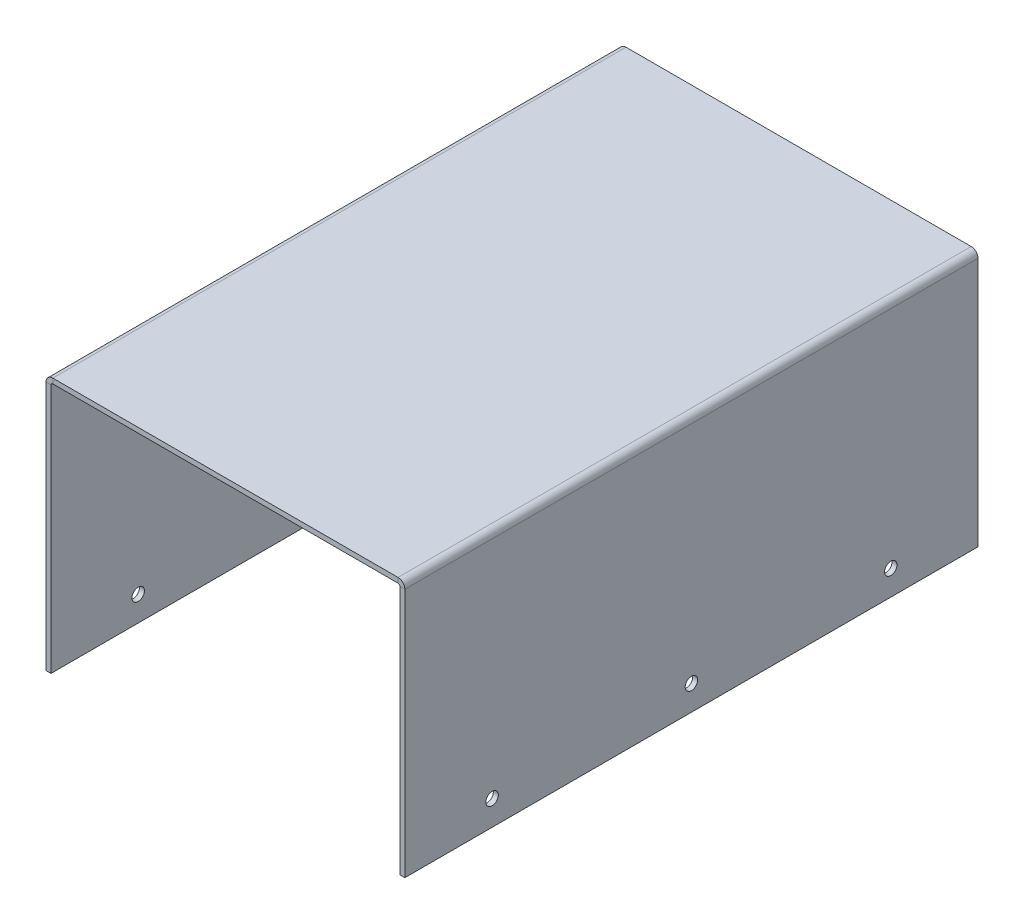
ISO-10303-21;
HEADER;
FILE_DESCRIPTION(('STEP AP214'),'2;1');
FILE_NAME('part.step','',(''),(''),'','','');
FILE_SCHEMA(('AUTOMOTIVE_DESIGN { 1 0 10303 214 1 1 1 1 }'));
ENDSEC;
DATA;
#1=APPLICATION_CONTEXT('core data for automotive mechanical design processes');
#2=APPLICATION_PROTOCOL_DEFINITION('international standard','automotive_design',2000,#1);
#3=PRODUCT_CONTEXT('',#1,'mechanical');
#4=PRODUCT('Part','Part','',(#3));
#5=PRODUCT_RELATED_PRODUCT_CATEGORY('part','',(#4));
#6=PRODUCT_DEFINITION_FORMATION('','',#4);
#7=PRODUCT_DEFINITION_CONTEXT('part definition',#1,'design');
#8=PRODUCT_DEFINITION('design','',#6,#7);
#9=PRODUCT_DEFINITION_SHAPE('','',#8);
#10=(LENGTH_UNIT() NAMED_UNIT(*) SI_UNIT(.MILLI.,.METRE.));
#11=(NAMED_UNIT(*) PLANE_ANGLE_UNIT() SI_UNIT($,.RADIAN.));
#12=(NAMED_UNIT(*) SI_UNIT($,.STERADIAN.) SOLID_ANGLE_UNIT());
#13=UNCERTAINTY_MEASURE_WITH_UNIT(LENGTH_MEASURE(1.E-05),#10,'distance_accuracy_value','');
#14=(GEOMETRIC_REPRESENTATION_CONTEXT(3) GLOBAL_UNCERTAINTY_ASSIGNED_CONTEXT((#13)) GLOBAL_UNIT_ASSIGNED_CONTEXT((#10,
#11,#12)) REPRESENTATION_CONTEXT('',''));
#15=CARTESIAN_POINT('',(0.,0.,0.));
#16=DIRECTION('',(0.,0.,1.));
#17=DIRECTION('',(1.,0.,0.));
#18=AXIS2_PLACEMENT_3D('',#15,#16,#17);
#19=CARTESIAN_POINT('',(-70.,2.,-115.));
#20=DIRECTION('',(0.,0.,1.));
#21=DIRECTION('',(1.,0.,0.));
#22=AXIS2_PLACEMENT_3D('',#19,#20,#21);
#23=PLANE('',#22);
#24=DIRECTION('',(0.,1.,0.));
#25=VECTOR('',#24,1.);
#26=CARTESIAN_POINT('',(-69.2634,0.,-115.));
#27=LINE('',#26,#25);
#28=CARTESIAN_POINT('',(-69.2634,0.,-115.));
#29=VERTEX_POINT('',#28);
#30=CARTESIAN_POINT('',(-69.2634,1.99999999999998,-115.));
#31=VERTEX_POINT('',#30);
#32=EDGE_CURVE('E193',#29,#31,#27,.T.);
#33=ORIENTED_EDGE('',*,*,#32,.T.);
#34=DIRECTION('',(-1.,0.,0.));
#35=VECTOR('',#34,1.);
#36=CARTESIAN_POINT('',(-70.,2.,-115.));
#37=LINE('',#36,#35);
#38=CARTESIAN_POINT('',(69.2634,2.,-115.));
#39=VERTEX_POINT('',#38);
#40=EDGE_CURVE('E58',#39,#31,#37,.T.);
#41=ORIENTED_EDGE('',*,*,#40,.F.);
#42=DIRECTION('',(0.,1.,0.));
#43=VECTOR('',#42,1.);
#44=CARTESIAN_POINT('',(69.2634,0.,-115.));
#45=LINE('',#44,#43);
#46=CARTESIAN_POINT('',(69.2634,0.,-115.));
#47=VERTEX_POINT('',#46);
#48=EDGE_CURVE('E270',#47,#39,#45,.T.);
#49=ORIENTED_EDGE('',*,*,#48,.F.);
#50=DIRECTION('',(-1.,0.,0.));
#51=VECTOR('',#50,1.);
#52=CARTESIAN_POINT('',(-70.,0.,-115.));
#53=LINE('',#52,#51);
#54=EDGE_CURVE('E273',#47,#29,#53,.T.);
#55=ORIENTED_EDGE('',*,*,#54,.T.);
#56=EDGE_LOOP('',(#33,#41,#49,#55));
#57=FACE_BOUND('',#56,.T.);
#58=ADVANCED_FACE('F50',(#57),#23,.F.);
#59=CARTESIAN_POINT('',(-70.,2.,115.));
#60=DIRECTION('',(0.,0.,-1.));
#61=DIRECTION('',(-1.,0.,0.));
#62=AXIS2_PLACEMENT_3D('',#59,#60,#61);
#63=PLANE('',#62);
#64=DIRECTION('',(0.,1.,0.));
#65=VECTOR('',#64,1.);
#66=CARTESIAN_POINT('',(-69.2634,0.,115.));
#67=LINE('',#66,#65);
#68=CARTESIAN_POINT('',(-69.2634,0.,115.));
#69=VERTEX_POINT('',#68);
#70=CARTESIAN_POINT('',(-69.2634,2.,115.));
#71=VERTEX_POINT('',#70);
#72=EDGE_CURVE('E199',#69,#71,#67,.T.);
#73=ORIENTED_EDGE('',*,*,#72,.F.);
#74=DIRECTION('',(1.,0.,0.));
#75=VECTOR('',#74,1.);
#76=CARTESIAN_POINT('',(-70.,0.,115.));
#77=LINE('',#76,#75);
#78=CARTESIAN_POINT('',(69.2634,0.,115.));
#79=VERTEX_POINT('',#78);
#80=EDGE_CURVE('E53',#69,#79,#77,.T.);
#81=ORIENTED_EDGE('',*,*,#80,.T.);
#82=DIRECTION('',(0.,1.,0.));
#83=VECTOR('',#82,1.);
#84=CARTESIAN_POINT('',(69.2634,0.,115.));
#85=LINE('',#84,#83);
#86=CARTESIAN_POINT('',(69.2634,2.00000000000001,115.));
#87=VERTEX_POINT('',#86);
#88=EDGE_CURVE('E259',#79,#87,#85,.T.);
#89=ORIENTED_EDGE('',*,*,#88,.T.);
#90=DIRECTION('',(1.,0.,0.));
#91=VECTOR('',#90,1.);
#92=CARTESIAN_POINT('',(-70.,2.,115.));
#93=LINE('',#92,#91);
#94=EDGE_CURVE('E13',#71,#87,#93,.T.);
#95=ORIENTED_EDGE('',*,*,#94,.F.);
#96=EDGE_LOOP('',(#73,#81,#89,#95));
#97=FACE_BOUND('',#96,.T.);
#98=ADVANCED_FACE('F337',(#97),#63,.F.);
#99=CARTESIAN_POINT('',(0.,2.,0.));
#100=DIRECTION('',(0.,-1.,0.));
#101=DIRECTION('',(0.,0.,-1.));
#102=AXIS2_PLACEMENT_3D('',#99,#100,#101);
#103=PLANE('',#102);
#104=DIRECTION('',(0.,0.,-1.));
#105=VECTOR('',#104,1.);
#106=CARTESIAN_POINT('',(-69.2634,1.99999999999998,-115.));
#107=LINE('',#106,#105);
#108=EDGE_CURVE('E147',#31,#71,#107,.F.);
#109=ORIENTED_EDGE('',*,*,#108,.T.);
#110=ORIENTED_EDGE('',*,*,#94,.T.);
#111=DIRECTION('',(0.,0.,1.));
#112=VECTOR('',#111,1.);
#113=CARTESIAN_POINT('',(69.2634,2.00000000000001,115.));
#114=LINE('',#113,#112);
#115=EDGE_CURVE('E253',#87,#39,#114,.F.);
#116=ORIENTED_EDGE('',*,*,#115,.T.);
#117=ORIENTED_EDGE('',*,*,#40,.T.);
#118=EDGE_LOOP('',(#109,#110,#116,#117));
#119=FACE_BOUND('',#118,.T.);
#120=ADVANCED_FACE('F388',(#119),#103,.F.);
#121=CARTESIAN_POINT('',(0.,0.,0.));
#122=DIRECTION('',(0.,-1.,0.));
#123=DIRECTION('',(0.,0.,-1.));
#124=AXIS2_PLACEMENT_3D('',#121,#122,#123);
#125=PLANE('',#124);
#126=ORIENTED_EDGE('',*,*,#80,.F.);
#127=DIRECTION('',(0.,0.,-1.));
#128=VECTOR('',#127,1.);
#129=CARTESIAN_POINT('',(-69.2634,0.,-115.));
#130=LINE('',#129,#128);
#131=EDGE_CURVE('E66',#29,#69,#130,.F.);
#132=ORIENTED_EDGE('',*,*,#131,.F.);
#133=ORIENTED_EDGE('',*,*,#54,.F.);
#134=DIRECTION('',(0.,0.,1.));
#135=VECTOR('',#134,1.);
#136=CARTESIAN_POINT('',(69.2634,0.,115.));
#137=LINE('',#136,#135);
#138=EDGE_CURVE('E265',#79,#47,#137,.F.);
#139=ORIENTED_EDGE('',*,*,#138,.F.);
#140=EDGE_LOOP('',(#126,#132,#133,#139));
#141=FACE_BOUND('',#140,.T.);
#142=ADVANCED_FACE('F338',(#141),#125,.T.);
#143=CARTESIAN_POINT('',(72.,2.57057950897709E-13,0.));
#144=DIRECTION('',(-1.,0.,0.));
#145=DIRECTION('',(0.,-1.,0.));
#146=AXIS2_PLACEMENT_3D('',#143,#144,#145);
#147=PLANE('',#146);
#148=CARTESIAN_POINT('',(72.0000000000003,-91.,-80.));
#149=DIRECTION('',(1.,0.,0.));
#150=DIRECTION('',(0.,0.,-1.));
#151=AXIS2_PLACEMENT_3D('',#148,#149,#150);
#152=CIRCLE('',#151,2.49999999999999);
#153=CARTESIAN_POINT('',(72.0000000000003,-91.,-82.5));
#154=VERTEX_POINT('',#153);
#155=EDGE_CURVE('E210',#154,#154,#152,.T.);
#156=ORIENTED_EDGE('',*,*,#155,.F.);
#157=EDGE_LOOP('',(#156));
#158=FACE_BOUND('',#157,.T.);
#159=CARTESIAN_POINT('',(72.0000000000003,-91.0000000000002,80.));
#160=DIRECTION('',(1.,0.,0.));
#161=DIRECTION('',(0.,0.,-1.));
#162=AXIS2_PLACEMENT_3D('',#159,#160,#161);
#163=CIRCLE('',#162,2.49999999999999);
#164=CARTESIAN_POINT('',(72.0000000000003,-91.0000000000002,77.5));
#165=VERTEX_POINT('',#164);
#166=EDGE_CURVE('E216',#165,#165,#163,.T.);
#167=ORIENTED_EDGE('',*,*,#166,.F.);
#168=EDGE_LOOP('',(#167));
#169=FACE_BOUND('',#168,.T.);
#170=DIRECTION('',(0.,0.,-1.));
#171=VECTOR('',#170,1.);
#172=CARTESIAN_POINT('',(72.,-0.73659999999999,0.));
#173=LINE('',#172,#171);
#174=CARTESIAN_POINT('',(72.,-0.736599999999983,115.));
#175=VERTEX_POINT('',#174);
#176=CARTESIAN_POINT('',(72.,-0.736599999999998,-115.));
#177=VERTEX_POINT('',#176);
#178=EDGE_CURVE('E228',#175,#177,#173,.T.);
#179=ORIENTED_EDGE('',*,*,#178,.F.);
#180=DIRECTION('',(0.,-1.,0.));
#181=VECTOR('',#180,1.);
#182=CARTESIAN_POINT('',(72.0000000000004,-101.,115.));
#183=LINE('',#182,#181);
#184=CARTESIAN_POINT('',(72.0000000000004,-101.,115.));
#185=VERTEX_POINT('',#184);
#186=EDGE_CURVE('E233',#175,#185,#183,.T.);
#187=ORIENTED_EDGE('',*,*,#186,.T.);
#188=DIRECTION('',(0.,0.,-1.));
#189=VECTOR('',#188,1.);
#190=CARTESIAN_POINT('',(72.0000000000004,-101.,-115.));
#191=LINE('',#190,#189);
#192=CARTESIAN_POINT('',(72.0000000000004,-101.,-115.));
#193=VERTEX_POINT('',#192);
#194=EDGE_CURVE('E235',#185,#193,#191,.T.);
#195=ORIENTED_EDGE('',*,*,#194,.T.);
#196=DIRECTION('',(0.,1.,0.));
#197=VECTOR('',#196,1.);
#198=CARTESIAN_POINT('',(72.,0.,-115.));
#199=LINE('',#198,#197);
#200=EDGE_CURVE('E238',#193,#177,#199,.T.);
#201=ORIENTED_EDGE('',*,*,#200,.T.);
#202=EDGE_LOOP('',(#179,#187,#195,#201));
#203=FACE_BOUND('',#202,.T.);
#204=CARTESIAN_POINT('',(72.0000000000003,-91.,0.));
#205=DIRECTION('',(1.,0.,0.));
#206=DIRECTION('',(0.,0.,-1.));
#207=AXIS2_PLACEMENT_3D('',#204,#205,#206);
#208=CIRCLE('',#207,2.49999999999999);
#209=CARTESIAN_POINT('',(72.0000000000003,-91.,-2.49999999999995));
#210=VERTEX_POINT('',#209);
#211=EDGE_CURVE('E202',#210,#210,#208,.T.);
#212=ORIENTED_EDGE('',*,*,#211,.F.);
#213=EDGE_LOOP('',(#212));
#214=FACE_BOUND('',#213,.T.);
#215=ADVANCED_FACE('F367',(#158,#169,#203,#214),#147,.F.);
#216=CARTESIAN_POINT('',(69.2634,-0.736600000000008,-115.));
#217=DIRECTION('',(0.,0.,-1.));
#218=DIRECTION('',(0.,1.,0.));
#219=AXIS2_PLACEMENT_3D('',#216,#217,#218);
#220=PLANE('',#219);
#221=DIRECTION('',(1.,0.,0.));
#222=VECTOR('',#221,1.);
#223=CARTESIAN_POINT('',(70.,-0.736600000000004,-115.));
#224=LINE('',#223,#222);
#225=CARTESIAN_POINT('',(70.,-0.736600000000005,-115.));
#226=VERTEX_POINT('',#225);
#227=EDGE_CURVE('E222',#226,#177,#224,.T.);
#228=ORIENTED_EDGE('',*,*,#227,.F.);
#229=CARTESIAN_POINT('',(69.2634,-0.736600000000008,-115.));
#230=DIRECTION('',(0.,0.,1.));
#231=DIRECTION('',(0.,-1.,0.));
#232=AXIS2_PLACEMENT_3D('',#229,#230,#231);
#233=CIRCLE('',#232,0.736600000000004);
#234=EDGE_CURVE('E262',#47,#226,#233,.F.);
#235=ORIENTED_EDGE('',*,*,#234,.F.);
#236=ORIENTED_EDGE('',*,*,#48,.T.);
#237=CARTESIAN_POINT('',(69.2634,-0.736600000000008,-115.));
#238=DIRECTION('',(0.,0.,1.));
#239=DIRECTION('',(0.,-1.,0.));
#240=AXIS2_PLACEMENT_3D('',#237,#238,#239);
#241=CIRCLE('',#240,2.7366);
#242=EDGE_CURVE('E255',#39,#177,#241,.F.);
#243=ORIENTED_EDGE('',*,*,#242,.T.);
#244=EDGE_LOOP('',(#228,#235,#236,#243));
#245=FACE_BOUND('',#244,.T.);
#246=ADVANCED_FACE('F373',(#245),#220,.T.);
#247=CARTESIAN_POINT('',(69.2634,-0.736599999999991,115.));
#248=DIRECTION('',(0.,0.,-1.));
#249=DIRECTION('',(0.,1.,0.));
#250=AXIS2_PLACEMENT_3D('',#247,#248,#249);
#251=PLANE('',#250);
#252=CARTESIAN_POINT('',(69.2634,-0.736599999999991,115.));
#253=DIRECTION('',(0.,0.,1.));
#254=DIRECTION('',(0.,-1.,0.));
#255=AXIS2_PLACEMENT_3D('',#252,#253,#254);
#256=CIRCLE('',#255,0.736600000000004);
#257=CARTESIAN_POINT('',(70.,-0.736599999999988,115.));
#258=VERTEX_POINT('',#257);
#259=EDGE_CURVE('E252',#258,#79,#256,.T.);
#260=ORIENTED_EDGE('',*,*,#259,.F.);
#261=DIRECTION('',(1.,0.,0.));
#262=VECTOR('',#261,1.);
#263=CARTESIAN_POINT('',(70.,-0.73659999999999,115.));
#264=LINE('',#263,#262);
#265=EDGE_CURVE('E225',#258,#175,#264,.T.);
#266=ORIENTED_EDGE('',*,*,#265,.T.);
#267=CARTESIAN_POINT('',(69.2634,-0.736599999999991,115.));
#268=DIRECTION('',(0.,0.,1.));
#269=DIRECTION('',(0.,-1.,0.));
#270=AXIS2_PLACEMENT_3D('',#267,#268,#269);
#271=CIRCLE('',#270,2.7366);
#272=EDGE_CURVE('E256',#175,#87,#271,.T.);
#273=ORIENTED_EDGE('',*,*,#272,.T.);
#274=ORIENTED_EDGE('',*,*,#88,.F.);
#275=EDGE_LOOP('',(#260,#266,#273,#274));
#276=FACE_BOUND('',#275,.T.);
#277=ADVANCED_FACE('F344',(#276),#251,.F.);
#278=CARTESIAN_POINT('',(69.2634,-0.736599999999991,115.));
#279=DIRECTION('',(0.,0.,1.));
#280=DIRECTION('',(1.,0.,0.));
#281=AXIS2_PLACEMENT_3D('',#278,#279,#280);
#282=CYLINDRICAL_SURFACE('',#281,2.7366);
#283=ORIENTED_EDGE('',*,*,#115,.F.);
#284=ORIENTED_EDGE('',*,*,#272,.F.);
#285=ORIENTED_EDGE('',*,*,#178,.T.);
#286=ORIENTED_EDGE('',*,*,#242,.F.);
#287=EDGE_LOOP('',(#283,#284,#285,#286));
#288=FACE_BOUND('',#287,.T.);
#289=ADVANCED_FACE('F371',(#288),#282,.T.);
#290=CARTESIAN_POINT('',(69.2634,-0.736599999999991,115.));
#291=DIRECTION('',(0.,0.,1.));
#292=DIRECTION('',(1.,0.,0.));
#293=AXIS2_PLACEMENT_3D('',#290,#291,#292);
#294=CYLINDRICAL_SURFACE('',#293,0.736600000000004);
#295=ORIENTED_EDGE('',*,*,#138,.T.);
#296=ORIENTED_EDGE('',*,*,#234,.T.);
#297=DIRECTION('',(0.,0.,1.));
#298=VECTOR('',#297,1.);
#299=CARTESIAN_POINT('',(70.,-0.736600000000004,-115.));
#300=LINE('',#299,#298);
#301=EDGE_CURVE('E223',#226,#258,#300,.T.);
#302=ORIENTED_EDGE('',*,*,#301,.T.);
#303=ORIENTED_EDGE('',*,*,#259,.T.);
#304=EDGE_LOOP('',(#295,#296,#302,#303));
#305=FACE_BOUND('',#304,.T.);
#306=ADVANCED_FACE('F347',(#305),#294,.F.);
#307=CARTESIAN_POINT('',(72.0000000000004,-101.,115.));
#308=DIRECTION('',(0.,0.,-1.));
#309=DIRECTION('',(0.,1.,0.));
#310=AXIS2_PLACEMENT_3D('',#307,#308,#309);
#311=PLANE('',#310);
#312=ORIENTED_EDGE('',*,*,#265,.F.);
#313=DIRECTION('',(0.,-1.,0.));
#314=VECTOR('',#313,1.);
#315=CARTESIAN_POINT('',(70.0000000000004,-101.,115.));
#316=LINE('',#315,#314);
#317=CARTESIAN_POINT('',(70.0000000000004,-101.,115.));
#318=VERTEX_POINT('',#317);
#319=EDGE_CURVE('E232',#258,#318,#316,.T.);
#320=ORIENTED_EDGE('',*,*,#319,.T.);
#321=DIRECTION('',(-1.,0.,0.));
#322=VECTOR('',#321,1.);
#323=CARTESIAN_POINT('',(72.0000000000004,-101.,115.));
#324=LINE('',#323,#322);
#325=EDGE_CURVE('E249',#185,#318,#324,.T.);
#326=ORIENTED_EDGE('',*,*,#325,.F.);
#327=ORIENTED_EDGE('',*,*,#186,.F.);
#328=EDGE_LOOP('',(#312,#320,#326,#327));
#329=FACE_BOUND('',#328,.T.);
#330=ADVANCED_FACE('F364',(#329),#311,.F.);
#331=CARTESIAN_POINT('',(72.,0.,-115.));
#332=DIRECTION('',(0.,0.,1.));
#333=DIRECTION('',(0.,-1.,0.));
#334=AXIS2_PLACEMENT_3D('',#331,#332,#333);
#335=PLANE('',#334);
#336=ORIENTED_EDGE('',*,*,#227,.T.);
#337=ORIENTED_EDGE('',*,*,#200,.F.);
#338=DIRECTION('',(-1.,0.,0.));
#339=VECTOR('',#338,1.);
#340=CARTESIAN_POINT('',(72.0000000000004,-101.,-115.));
#341=LINE('',#340,#339);
#342=CARTESIAN_POINT('',(70.0000000000004,-101.,-115.));
#343=VERTEX_POINT('',#342);
#344=EDGE_CURVE('E241',#193,#343,#341,.T.);
#345=ORIENTED_EDGE('',*,*,#344,.T.);
#346=DIRECTION('',(0.,1.,0.));
#347=VECTOR('',#346,1.);
#348=CARTESIAN_POINT('',(70.,0.,-115.));
#349=LINE('',#348,#347);
#350=EDGE_CURVE('E236',#343,#226,#349,.T.);
#351=ORIENTED_EDGE('',*,*,#350,.T.);
#352=EDGE_LOOP('',(#336,#337,#345,#351));
#353=FACE_BOUND('',#352,.T.);
#354=ADVANCED_FACE('F355',(#353),#335,.F.);
#355=CARTESIAN_POINT('',(70.,2.50074988220023E-13,0.));
#356=DIRECTION('',(-1.,0.,0.));
#357=DIRECTION('',(0.,-1.,0.));
#358=AXIS2_PLACEMENT_3D('',#355,#356,#357);
#359=PLANE('',#358);
#360=CARTESIAN_POINT('',(70.0000000000003,-91.,0.));
#361=DIRECTION('',(-1.,0.,0.));
#362=DIRECTION('',(0.,-1.,0.));
#363=AXIS2_PLACEMENT_3D('',#360,#361,#362);
#364=CIRCLE('',#363,2.5);
#365=CARTESIAN_POINT('',(70.0000000000003,-93.5,0.));
#366=VERTEX_POINT('',#365);
#367=EDGE_CURVE('E207',#366,#366,#364,.T.);
#368=ORIENTED_EDGE('',*,*,#367,.F.);
#369=EDGE_LOOP('',(#368));
#370=FACE_BOUND('',#369,.T.);
#371=CARTESIAN_POINT('',(70.0000000000003,-91.,-80.));
#372=DIRECTION('',(-1.,0.,0.));
#373=DIRECTION('',(0.,-1.,0.));
#374=AXIS2_PLACEMENT_3D('',#371,#372,#373);
#375=CIRCLE('',#374,2.5);
#376=CARTESIAN_POINT('',(70.0000000000004,-93.5,-80.));
#377=VERTEX_POINT('',#376);
#378=EDGE_CURVE('E213',#377,#377,#375,.T.);
#379=ORIENTED_EDGE('',*,*,#378,.F.);
#380=EDGE_LOOP('',(#379));
#381=FACE_BOUND('',#380,.T.);
#382=CARTESIAN_POINT('',(70.0000000000003,-91.0000000000002,80.));
#383=DIRECTION('',(-1.,0.,0.));
#384=DIRECTION('',(0.,-1.,0.));
#385=AXIS2_PLACEMENT_3D('',#382,#383,#384);
#386=CIRCLE('',#385,2.5);
#387=CARTESIAN_POINT('',(70.0000000000003,-93.5000000000002,80.));
#388=VERTEX_POINT('',#387);
#389=EDGE_CURVE('E219',#388,#388,#386,.T.);
#390=ORIENTED_EDGE('',*,*,#389,.F.);
#391=EDGE_LOOP('',(#390));
#392=FACE_BOUND('',#391,.T.);
#393=ORIENTED_EDGE('',*,*,#319,.F.);
#394=ORIENTED_EDGE('',*,*,#301,.F.);
#395=ORIENTED_EDGE('',*,*,#350,.F.);
#396=DIRECTION('',(0.,0.,-1.));
#397=VECTOR('',#396,1.);
#398=CARTESIAN_POINT('',(70.0000000000004,-101.,-115.));
#399=LINE('',#398,#397);
#400=EDGE_CURVE('E243',#318,#343,#399,.T.);
#401=ORIENTED_EDGE('',*,*,#400,.F.);
#402=EDGE_LOOP('',(#393,#394,#395,#401));
#403=FACE_BOUND('',#402,.T.);
#404=ADVANCED_FACE('F352',(#370,#381,#392,#403),#359,.T.);
#405=CARTESIAN_POINT('',(72.0000000000004,-101.,-115.));
#406=DIRECTION('',(0.,1.,0.));
#407=DIRECTION('',(-1.,0.,0.));
#408=AXIS2_PLACEMENT_3D('',#405,#406,#407);
#409=PLANE('',#408);
#410=ORIENTED_EDGE('',*,*,#400,.T.);
#411=ORIENTED_EDGE('',*,*,#344,.F.);
#412=ORIENTED_EDGE('',*,*,#194,.F.);
#413=ORIENTED_EDGE('',*,*,#325,.T.);
#414=EDGE_LOOP('',(#410,#411,#412,#413));
#415=FACE_BOUND('',#414,.T.);
#416=ADVANCED_FACE('F360',(#415),#409,.F.);
#417=CARTESIAN_POINT('',(72.0000000000003,-91.0000000000002,80.));
#418=DIRECTION('',(1.,0.,0.));
#419=DIRECTION('',(0.,0.,-1.));
#420=AXIS2_PLACEMENT_3D('',#417,#418,#419);
#421=CYLINDRICAL_SURFACE('',#420,2.5);
#422=ORIENTED_EDGE('',*,*,#166,.T.);
#423=EDGE_LOOP('',(#422));
#424=FACE_BOUND('',#423,.T.);
#425=ORIENTED_EDGE('',*,*,#389,.T.);
#426=EDGE_LOOP('',(#425));
#427=FACE_BOUND('',#426,.T.);
#428=ADVANCED_FACE('F429',(#424,#427),#421,.F.);
#429=CARTESIAN_POINT('',(72.0000000000003,-91.,-80.));
#430=DIRECTION('',(1.,0.,0.));
#431=DIRECTION('',(0.,0.,-1.));
#432=AXIS2_PLACEMENT_3D('',#429,#430,#431);
#433=CYLINDRICAL_SURFACE('',#432,2.5);
#434=ORIENTED_EDGE('',*,*,#155,.T.);
#435=EDGE_LOOP('',(#434));
#436=FACE_BOUND('',#435,.T.);
#437=ORIENTED_EDGE('',*,*,#378,.T.);
#438=EDGE_LOOP('',(#437));
#439=FACE_BOUND('',#438,.T.);
#440=ADVANCED_FACE('F434',(#436,#439),#433,.F.);
#441=CARTESIAN_POINT('',(72.0000000000003,-91.,0.));
#442=DIRECTION('',(1.,0.,0.));
#443=DIRECTION('',(0.,0.,-1.));
#444=AXIS2_PLACEMENT_3D('',#441,#442,#443);
#445=CYLINDRICAL_SURFACE('',#444,2.5);
#446=ORIENTED_EDGE('',*,*,#211,.T.);
#447=EDGE_LOOP('',(#446));
#448=FACE_BOUND('',#447,.T.);
#449=ORIENTED_EDGE('',*,*,#367,.T.);
#450=EDGE_LOOP('',(#449));
#451=FACE_BOUND('',#450,.T.);
#452=ADVANCED_FACE('F444',(#448,#451),#445,.F.);
#453=CARTESIAN_POINT('',(-69.2634,-0.736600000000005,115.));
#454=DIRECTION('',(0.,0.,1.));
#455=DIRECTION('',(0.,-1.,0.));
#456=AXIS2_PLACEMENT_3D('',#453,#454,#455);
#457=PLANE('',#456);
#458=DIRECTION('',(-1.,0.,0.));
#459=VECTOR('',#458,1.);
#460=CARTESIAN_POINT('',(-70.,-0.736600000000004,115.));
#461=LINE('',#460,#459);
#462=CARTESIAN_POINT('',(-70.,-0.736600000000002,115.));
#463=VERTEX_POINT('',#462);
#464=CARTESIAN_POINT('',(-72.,-0.736599999999995,115.));
#465=VERTEX_POINT('',#464);
#466=EDGE_CURVE('E283',#463,#465,#461,.T.);
#467=ORIENTED_EDGE('',*,*,#466,.F.);
#468=CARTESIAN_POINT('',(-69.2634,-0.736600000000005,115.));
#469=DIRECTION('',(0.,0.,-1.));
#470=DIRECTION('',(0.,1.,0.));
#471=AXIS2_PLACEMENT_3D('',#468,#469,#470);
#472=CIRCLE('',#471,0.736600000000004);
#473=EDGE_CURVE('E150',#69,#463,#472,.F.);
#474=ORIENTED_EDGE('',*,*,#473,.F.);
#475=ORIENTED_EDGE('',*,*,#72,.T.);
#476=CARTESIAN_POINT('',(-69.2634,-0.736600000000005,115.));
#477=DIRECTION('',(0.,0.,-1.));
#478=DIRECTION('',(0.,1.,0.));
#479=AXIS2_PLACEMENT_3D('',#476,#477,#478);
#480=CIRCLE('',#479,2.7366);
#481=EDGE_CURVE('E192',#71,#465,#480,.F.);
#482=ORIENTED_EDGE('',*,*,#481,.T.);
#483=EDGE_LOOP('',(#467,#474,#475,#482));
#484=FACE_BOUND('',#483,.T.);
#485=ADVANCED_FACE('F335',(#484),#457,.T.);
#486=CARTESIAN_POINT('',(-69.2634,-0.736600000000022,-115.));
#487=DIRECTION('',(0.,0.,1.));
#488=DIRECTION('',(0.,-1.,0.));
#489=AXIS2_PLACEMENT_3D('',#486,#487,#488);
#490=PLANE('',#489);
#491=CARTESIAN_POINT('',(-69.2634,-0.736600000000022,-115.));
#492=DIRECTION('',(0.,0.,-1.));
#493=DIRECTION('',(0.,1.,0.));
#494=AXIS2_PLACEMENT_3D('',#491,#492,#493);
#495=CIRCLE('',#494,0.736600000000004);
#496=CARTESIAN_POINT('',(-70.,-0.736600000000019,-115.));
#497=VERTEX_POINT('',#496);
#498=EDGE_CURVE('E157',#497,#29,#495,.T.);
#499=ORIENTED_EDGE('',*,*,#498,.F.);
#500=DIRECTION('',(-1.,0.,0.));
#501=VECTOR('',#500,1.);
#502=CARTESIAN_POINT('',(-70.,-0.736600000000018,-115.));
#503=LINE('',#502,#501);
#504=CARTESIAN_POINT('',(-72.,-0.736600000000011,-115.));
#505=VERTEX_POINT('',#504);
#506=EDGE_CURVE('E154',#497,#505,#503,.T.);
#507=ORIENTED_EDGE('',*,*,#506,.T.);
#508=CARTESIAN_POINT('',(-69.2634,-0.736600000000022,-115.));
#509=DIRECTION('',(0.,0.,-1.));
#510=DIRECTION('',(0.,1.,0.));
#511=AXIS2_PLACEMENT_3D('',#508,#509,#510);
#512=CIRCLE('',#511,2.7366);
#513=EDGE_CURVE('E140',#505,#31,#512,.T.);
#514=ORIENTED_EDGE('',*,*,#513,.T.);
#515=ORIENTED_EDGE('',*,*,#32,.F.);
#516=EDGE_LOOP('',(#499,#507,#514,#515));
#517=FACE_BOUND('',#516,.T.);
#518=ADVANCED_FACE('F155',(#517),#490,.F.);
#519=CARTESIAN_POINT('',(-69.2634,-0.736600000000022,-115.));
#520=DIRECTION('',(0.,0.,-1.));
#521=DIRECTION('',(-1.,0.,0.));
#522=AXIS2_PLACEMENT_3D('',#519,#520,#521);
#523=CYLINDRICAL_SURFACE('',#522,2.7366);
#524=ORIENTED_EDGE('',*,*,#108,.F.);
#525=ORIENTED_EDGE('',*,*,#513,.F.);
#526=DIRECTION('',(0.,0.,1.));
#527=VECTOR('',#526,1.);
#528=CARTESIAN_POINT('',(-72.,-0.736600000000004,0.));
#529=LINE('',#528,#527);
#530=EDGE_CURVE('E145',#505,#465,#529,.T.);
#531=ORIENTED_EDGE('',*,*,#530,.T.);
#532=ORIENTED_EDGE('',*,*,#481,.F.);
#533=EDGE_LOOP('',(#524,#525,#531,#532));
#534=FACE_BOUND('',#533,.T.);
#535=ADVANCED_FACE('F142',(#534),#523,.T.);
#536=CARTESIAN_POINT('',(-69.2634,-0.736600000000022,-115.));
#537=DIRECTION('',(0.,0.,-1.));
#538=DIRECTION('',(-1.,0.,0.));
#539=AXIS2_PLACEMENT_3D('',#536,#537,#538);
#540=CYLINDRICAL_SURFACE('',#539,0.736600000000004);
#541=ORIENTED_EDGE('',*,*,#131,.T.);
#542=ORIENTED_EDGE('',*,*,#473,.T.);
#543=DIRECTION('',(0.,0.,-1.));
#544=VECTOR('',#543,1.);
#545=CARTESIAN_POINT('',(-70.,-0.736600000000004,115.));
#546=LINE('',#545,#544);
#547=EDGE_CURVE('E162',#463,#497,#546,.T.);
#548=ORIENTED_EDGE('',*,*,#547,.T.);
#549=ORIENTED_EDGE('',*,*,#498,.T.);
#550=EDGE_LOOP('',(#541,#542,#548,#549));
#551=FACE_BOUND('',#550,.T.);
#552=ADVANCED_FACE('F278',(#551),#540,.F.);
#553=CARTESIAN_POINT('',(-72.0000000000004,-101.,115.));
#554=DIRECTION('',(0.,0.,1.));
#555=DIRECTION('',(0.,-1.,0.));
#556=AXIS2_PLACEMENT_3D('',#553,#554,#555);
#557=PLANE('',#556);
#558=DIRECTION('',(0.,-1.,0.));
#559=VECTOR('',#558,1.);
#560=CARTESIAN_POINT('',(-70.0000000000004,-101.,115.));
#561=LINE('',#560,#559);
#562=CARTESIAN_POINT('',(-70.0000000000004,-101.,115.));
#563=VERTEX_POINT('',#562);
#564=EDGE_CURVE('E172',#463,#563,#561,.T.);
#565=ORIENTED_EDGE('',*,*,#564,.F.);
#566=ORIENTED_EDGE('',*,*,#466,.T.);
#567=DIRECTION('',(0.,-1.,0.));
#568=VECTOR('',#567,1.);
#569=CARTESIAN_POINT('',(-72.0000000000004,-101.,115.));
#570=LINE('',#569,#568);
#571=CARTESIAN_POINT('',(-72.0000000000004,-101.,115.));
#572=VERTEX_POINT('',#571);
#573=EDGE_CURVE('E171',#465,#572,#570,.T.);
#574=ORIENTED_EDGE('',*,*,#573,.T.);
#575=DIRECTION('',(1.,0.,0.));
#576=VECTOR('',#575,1.);
#577=CARTESIAN_POINT('',(-72.0000000000004,-101.,115.));
#578=LINE('',#577,#576);
#579=EDGE_CURVE('E178',#572,#563,#578,.T.);
#580=ORIENTED_EDGE('',*,*,#579,.T.);
#581=EDGE_LOOP('',(#565,#566,#574,#580));
#582=FACE_BOUND('',#581,.T.);
#583=ADVANCED_FACE('F333',(#582),#557,.T.);
#584=CARTESIAN_POINT('',(-72.,0.,-115.));
#585=DIRECTION('',(0.,0.,-1.));
#586=DIRECTION('',(0.,1.,0.));
#587=AXIS2_PLACEMENT_3D('',#584,#585,#586);
#588=PLANE('',#587);
#589=DIRECTION('',(0.,1.,0.));
#590=VECTOR('',#589,1.);
#591=CARTESIAN_POINT('',(-72.,0.,-115.));
#592=LINE('',#591,#590);
#593=CARTESIAN_POINT('',(-72.0000000000004,-101.,-115.));
#594=VERTEX_POINT('',#593);
#595=EDGE_CURVE('E169',#594,#505,#592,.T.);
#596=ORIENTED_EDGE('',*,*,#595,.T.);
#597=ORIENTED_EDGE('',*,*,#506,.F.);
#598=DIRECTION('',(0.,1.,0.));
#599=VECTOR('',#598,1.);
#600=CARTESIAN_POINT('',(-70.,0.,-115.));
#601=LINE('',#600,#599);
#602=CARTESIAN_POINT('',(-70.0000000000004,-101.,-115.));
#603=VERTEX_POINT('',#602);
#604=EDGE_CURVE('E184',#603,#497,#601,.T.);
#605=ORIENTED_EDGE('',*,*,#604,.F.);
#606=DIRECTION('',(1.,0.,0.));
#607=VECTOR('',#606,1.);
#608=CARTESIAN_POINT('',(-72.0000000000004,-101.,-115.));
#609=LINE('',#608,#607);
#610=EDGE_CURVE('E175',#594,#603,#609,.T.);
#611=ORIENTED_EDGE('',*,*,#610,.F.);
#612=EDGE_LOOP('',(#596,#597,#605,#611));
#613=FACE_BOUND('',#612,.T.);
#614=ADVANCED_FACE('F174',(#613),#588,.T.);
#615=CARTESIAN_POINT('',(-72.,2.57057950897709E-13,0.));
#616=DIRECTION('',(1.,0.,0.));
#617=DIRECTION('',(0.,-1.,0.));
#618=AXIS2_PLACEMENT_3D('',#615,#616,#617);
#619=PLANE('',#618);
#620=CARTESIAN_POINT('',(-72.0000000000003,-91.,0.));
#621=DIRECTION('',(-1.,0.,0.));
#622=DIRECTION('',(0.,0.,1.));
#623=AXIS2_PLACEMENT_3D('',#620,#621,#622);
#624=CIRCLE('',#623,2.49999999999999);
#625=CARTESIAN_POINT('',(-72.0000000000003,-91.,2.50000000000003));
#626=VERTEX_POINT('',#625);
#627=EDGE_CURVE('E303',#626,#626,#624,.T.);
#628=ORIENTED_EDGE('',*,*,#627,.F.);
#629=EDGE_LOOP('',(#628));
#630=FACE_BOUND('',#629,.T.);
#631=CARTESIAN_POINT('',(-72.0000000000003,-91.,-80.));
#632=DIRECTION('',(-1.,0.,0.));
#633=DIRECTION('',(0.,0.,1.));
#634=AXIS2_PLACEMENT_3D('',#631,#632,#633);
#635=CIRCLE('',#634,2.49999999999999);
#636=CARTESIAN_POINT('',(-72.0000000000003,-91.,-77.5));
#637=VERTEX_POINT('',#636);
#638=EDGE_CURVE('E297',#637,#637,#635,.T.);
#639=ORIENTED_EDGE('',*,*,#638,.F.);
#640=EDGE_LOOP('',(#639));
#641=FACE_BOUND('',#640,.T.);
#642=CARTESIAN_POINT('',(-72.0000000000003,-91.0000000000002,80.));
#643=DIRECTION('',(-1.,0.,0.));
#644=DIRECTION('',(0.,0.,1.));
#645=AXIS2_PLACEMENT_3D('',#642,#643,#644);
#646=CIRCLE('',#645,2.49999999999999);
#647=CARTESIAN_POINT('',(-72.0000000000003,-91.0000000000002,82.5));
#648=VERTEX_POINT('',#647);
#649=EDGE_CURVE('E291',#648,#648,#646,.T.);
#650=ORIENTED_EDGE('',*,*,#649,.F.);
#651=EDGE_LOOP('',(#650));
#652=FACE_BOUND('',#651,.T.);
#653=ORIENTED_EDGE('',*,*,#530,.F.);
#654=ORIENTED_EDGE('',*,*,#595,.F.);
#655=DIRECTION('',(0.,0.,-1.));
#656=VECTOR('',#655,1.);
#657=CARTESIAN_POINT('',(-72.0000000000004,-101.,-115.));
#658=LINE('',#657,#656);
#659=EDGE_CURVE('E176',#572,#594,#658,.T.);
#660=ORIENTED_EDGE('',*,*,#659,.F.);
#661=ORIENTED_EDGE('',*,*,#573,.F.);
#662=EDGE_LOOP('',(#653,#654,#660,#661));
#663=FACE_BOUND('',#662,.T.);
#664=ADVANCED_FACE('F167',(#630,#641,#652,#663),#619,.F.);
#665=CARTESIAN_POINT('',(-70.,2.50074988220023E-13,0.));
#666=DIRECTION('',(1.,0.,0.));
#667=DIRECTION('',(0.,-1.,0.));
#668=AXIS2_PLACEMENT_3D('',#665,#666,#667);
#669=PLANE('',#668);
#670=CARTESIAN_POINT('',(-70.0000000000003,-91.,0.));
#671=DIRECTION('',(1.,0.,0.));
#672=DIRECTION('',(0.,1.,0.));
#673=AXIS2_PLACEMENT_3D('',#670,#671,#672);
#674=CIRCLE('',#673,2.5);
#675=CARTESIAN_POINT('',(-70.0000000000003,-88.5,0.));
#676=VERTEX_POINT('',#675);
#677=EDGE_CURVE('E300',#676,#676,#674,.T.);
#678=ORIENTED_EDGE('',*,*,#677,.F.);
#679=EDGE_LOOP('',(#678));
#680=FACE_BOUND('',#679,.T.);
#681=CARTESIAN_POINT('',(-70.0000000000003,-91.,-80.));
#682=DIRECTION('',(1.,0.,0.));
#683=DIRECTION('',(0.,1.,0.));
#684=AXIS2_PLACEMENT_3D('',#681,#682,#683);
#685=CIRCLE('',#684,2.5);
#686=CARTESIAN_POINT('',(-70.0000000000003,-88.5,-80.));
#687=VERTEX_POINT('',#686);
#688=EDGE_CURVE('E294',#687,#687,#685,.T.);
#689=ORIENTED_EDGE('',*,*,#688,.F.);
#690=EDGE_LOOP('',(#689));
#691=FACE_BOUND('',#690,.T.);
#692=CARTESIAN_POINT('',(-70.0000000000003,-91.0000000000002,80.));
#693=DIRECTION('',(1.,0.,0.));
#694=DIRECTION('',(0.,1.,0.));
#695=AXIS2_PLACEMENT_3D('',#692,#693,#694);
#696=CIRCLE('',#695,2.5);
#697=CARTESIAN_POINT('',(-70.0000000000003,-88.5000000000002,80.));
#698=VERTEX_POINT('',#697);
#699=EDGE_CURVE('E286',#698,#698,#696,.T.);
#700=ORIENTED_EDGE('',*,*,#699,.F.);
#701=EDGE_LOOP('',(#700));
#702=FACE_BOUND('',#701,.T.);
#703=ORIENTED_EDGE('',*,*,#604,.T.);
#704=ORIENTED_EDGE('',*,*,#547,.F.);
#705=ORIENTED_EDGE('',*,*,#564,.T.);
#706=DIRECTION('',(0.,0.,-1.));
#707=VECTOR('',#706,1.);
#708=CARTESIAN_POINT('',(-70.0000000000004,-101.,-115.));
#709=LINE('',#708,#707);
#710=EDGE_CURVE('E180',#563,#603,#709,.T.);
#711=ORIENTED_EDGE('',*,*,#710,.T.);
#712=EDGE_LOOP('',(#703,#704,#705,#711));
#713=FACE_BOUND('',#712,.T.);
#714=ADVANCED_FACE('F312',(#680,#691,#702,#713),#669,.T.);
#715=CARTESIAN_POINT('',(-72.0000000000004,-101.,-115.));
#716=DIRECTION('',(0.,-1.,0.));
#717=DIRECTION('',(1.,0.,0.));
#718=AXIS2_PLACEMENT_3D('',#715,#716,#717);
#719=PLANE('',#718);
#720=ORIENTED_EDGE('',*,*,#710,.F.);
#721=ORIENTED_EDGE('',*,*,#579,.F.);
#722=ORIENTED_EDGE('',*,*,#659,.T.);
#723=ORIENTED_EDGE('',*,*,#610,.T.);
#724=EDGE_LOOP('',(#720,#721,#722,#723));
#725=FACE_BOUND('',#724,.T.);
#726=ADVANCED_FACE('F322',(#725),#719,.T.);
#727=CARTESIAN_POINT('',(-72.0000000000003,-91.0000000000002,80.));
#728=DIRECTION('',(-1.,0.,0.));
#729=DIRECTION('',(0.,0.,1.));
#730=AXIS2_PLACEMENT_3D('',#727,#728,#729);
#731=CYLINDRICAL_SURFACE('',#730,2.5);
#732=ORIENTED_EDGE('',*,*,#649,.T.);
#733=EDGE_LOOP('',(#732));
#734=FACE_BOUND('',#733,.T.);
#735=ORIENTED_EDGE('',*,*,#699,.T.);
#736=EDGE_LOOP('',(#735));
#737=FACE_BOUND('',#736,.T.);
#738=ADVANCED_FACE('F318',(#734,#737),#731,.F.);
#739=CARTESIAN_POINT('',(-72.0000000000003,-91.,-80.));
#740=DIRECTION('',(-1.,0.,0.));
#741=DIRECTION('',(0.,0.,1.));
#742=AXIS2_PLACEMENT_3D('',#739,#740,#741);
#743=CYLINDRICAL_SURFACE('',#742,2.5);
#744=ORIENTED_EDGE('',*,*,#638,.T.);
#745=EDGE_LOOP('',(#744));
#746=FACE_BOUND('',#745,.T.);
#747=ORIENTED_EDGE('',*,*,#688,.T.);
#748=EDGE_LOOP('',(#747));
#749=FACE_BOUND('',#748,.T.);
#750=ADVANCED_FACE('F321',(#746,#749),#743,.F.);
#751=CARTESIAN_POINT('',(-72.0000000000003,-91.,0.));
#752=DIRECTION('',(-1.,0.,0.));
#753=DIRECTION('',(0.,0.,1.));
#754=AXIS2_PLACEMENT_3D('',#751,#752,#753);
#755=CYLINDRICAL_SURFACE('',#754,2.5);
#756=ORIENTED_EDGE('',*,*,#627,.T.);
#757=EDGE_LOOP('',(#756));
#758=FACE_BOUND('',#757,.T.);
#759=ORIENTED_EDGE('',*,*,#677,.T.);
#760=EDGE_LOOP('',(#759));
#761=FACE_BOUND('',#760,.T.);
#762=ADVANCED_FACE('F307',(#758,#761),#755,.F.);
#763=CLOSED_SHELL('',(#58,#98,#120,#142,#215,#246,#277,#289,#306,#330,#354,#404,#416,#428,#440,
#452,#485,#518,#535,#552,#583,#614,#664,#714,#726,#738,#750,#762));
#764=MANIFOLD_SOLID_BREP('B2',#763);
#765=ADVANCED_BREP_SHAPE_REPRESENTATION('',(#18,#764),#14);
#766=SHAPE_DEFINITION_REPRESENTATION(#9,#765);
ENDSEC;
END-ISO-10303-21;
